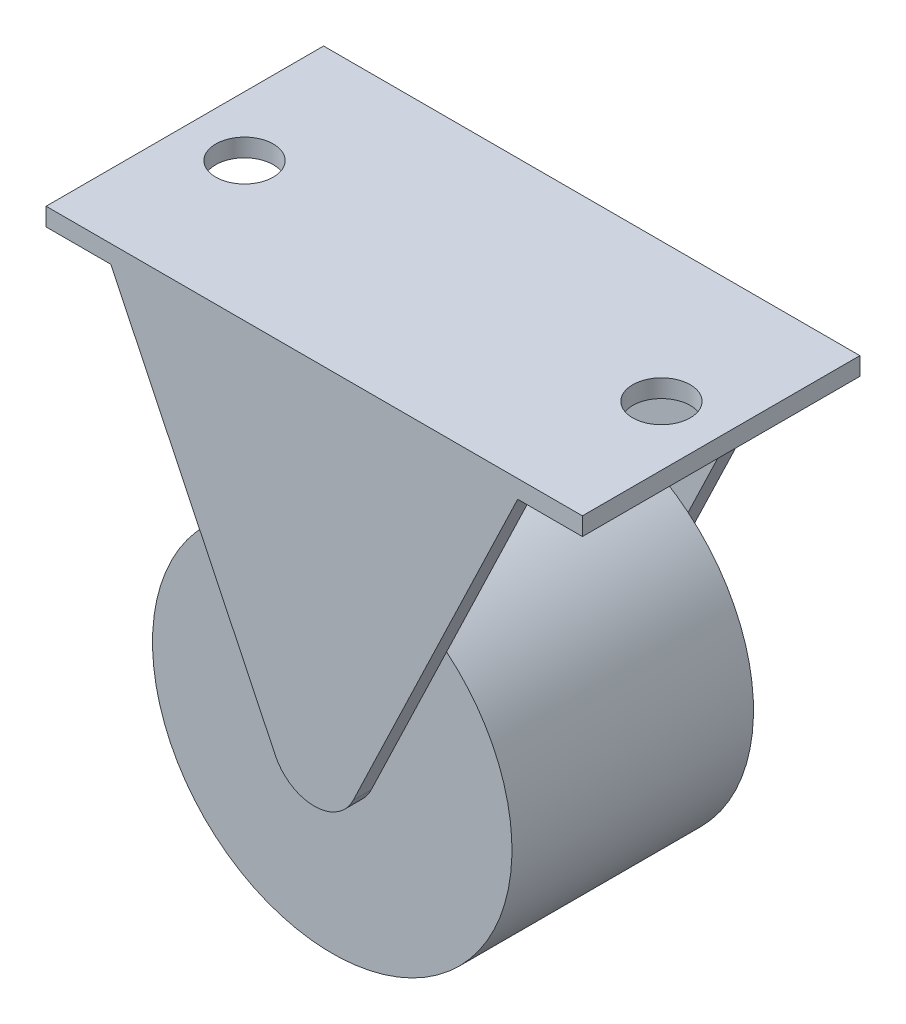
ISO-10303-21;
HEADER;
FILE_DESCRIPTION(('STEP AP214'),'2;1');
FILE_NAME('part.step','',(''),(''),'','','');
FILE_SCHEMA(('AUTOMOTIVE_DESIGN { 1 0 10303 214 1 1 1 1 }'));
ENDSEC;
DATA;
#1=APPLICATION_CONTEXT('core data for automotive mechanical design processes');
#2=APPLICATION_PROTOCOL_DEFINITION('international standard','automotive_design',2000,#1);
#3=PRODUCT_CONTEXT('',#1,'mechanical');
#4=PRODUCT('Part','Part','',(#3));
#5=PRODUCT_RELATED_PRODUCT_CATEGORY('part','',(#4));
#6=PRODUCT_DEFINITION_FORMATION('','',#4);
#7=PRODUCT_DEFINITION_CONTEXT('part definition',#1,'design');
#8=PRODUCT_DEFINITION('design','',#6,#7);
#9=PRODUCT_DEFINITION_SHAPE('','',#8);
#10=(LENGTH_UNIT() NAMED_UNIT(*) SI_UNIT(.MILLI.,.METRE.));
#11=(NAMED_UNIT(*) PLANE_ANGLE_UNIT() SI_UNIT($,.RADIAN.));
#12=(NAMED_UNIT(*) SI_UNIT($,.STERADIAN.) SOLID_ANGLE_UNIT());
#13=UNCERTAINTY_MEASURE_WITH_UNIT(LENGTH_MEASURE(1.E-05),#10,'distance_accuracy_value','');
#14=(GEOMETRIC_REPRESENTATION_CONTEXT(3) GLOBAL_UNCERTAINTY_ASSIGNED_CONTEXT((#13)) GLOBAL_UNIT_ASSIGNED_CONTEXT((#10,
#11,#12)) REPRESENTATION_CONTEXT('',''));
#15=CARTESIAN_POINT('',(0.,0.,0.));
#16=DIRECTION('',(0.,0.,1.));
#17=DIRECTION('',(1.,0.,0.));
#18=AXIS2_PLACEMENT_3D('',#15,#16,#17);
#19=CARTESIAN_POINT('',(0.,0.,0.));
#20=DIRECTION('',(0.,1.,0.));
#21=DIRECTION('',(0.,0.,1.));
#22=AXIS2_PLACEMENT_3D('',#19,#20,#21);
#23=PLANE('',#22);
#24=CARTESIAN_POINT('',(-14.5,0.,0.));
#25=DIRECTION('',(0.,1.,0.));
#26=DIRECTION('',(0.,0.,1.));
#27=AXIS2_PLACEMENT_3D('',#24,#25,#26);
#28=CIRCLE('',#27,2.);
#29=CARTESIAN_POINT('',(-14.5,0.,2.));
#30=VERTEX_POINT('',#29);
#31=EDGE_CURVE('E220',#30,#30,#28,.T.);
#32=ORIENTED_EDGE('',*,*,#31,.T.);
#33=EDGE_LOOP('',(#32));
#34=FACE_BOUND('',#33,.T.);
#35=CARTESIAN_POINT('',(14.5,0.,0.));
#36=DIRECTION('',(0.,1.,0.));
#37=DIRECTION('',(0.,0.,-1.));
#38=AXIS2_PLACEMENT_3D('',#35,#36,#37);
#39=CIRCLE('',#38,2.);
#40=CARTESIAN_POINT('',(14.5,0.,-2.));
#41=VERTEX_POINT('',#40);
#42=EDGE_CURVE('E211',#41,#41,#39,.T.);
#43=ORIENTED_EDGE('',*,*,#42,.T.);
#44=EDGE_LOOP('',(#43));
#45=FACE_BOUND('',#44,.T.);
#46=DIRECTION('',(0.,0.,-1.));
#47=VECTOR('',#46,1.);
#48=CARTESIAN_POINT('',(14.15,0.,-8.4));
#49=LINE('',#48,#47);
#50=CARTESIAN_POINT('',(14.15,0.,-8.4));
#51=VERTEX_POINT('',#50);
#52=CARTESIAN_POINT('',(14.15,0.,-9.65));
#53=VERTEX_POINT('',#52);
#54=EDGE_CURVE('E181',#51,#53,#49,.T.);
#55=ORIENTED_EDGE('',*,*,#54,.T.);
#56=DIRECTION('',(-1.,0.,0.));
#57=VECTOR('',#56,1.);
#58=CARTESIAN_POINT('',(-18.65,0.,-9.65));
#59=LINE('',#58,#57);
#60=CARTESIAN_POINT('',(18.65,0.,-9.65));
#61=VERTEX_POINT('',#60);
#62=EDGE_CURVE('E233',#61,#53,#59,.T.);
#63=ORIENTED_EDGE('',*,*,#62,.F.);
#64=DIRECTION('',(0.,0.,-1.));
#65=VECTOR('',#64,1.);
#66=CARTESIAN_POINT('',(18.65,0.,-9.65));
#67=LINE('',#66,#65);
#68=CARTESIAN_POINT('',(18.65,0.,9.65));
#69=VERTEX_POINT('',#68);
#70=EDGE_CURVE('E246',#69,#61,#67,.T.);
#71=ORIENTED_EDGE('',*,*,#70,.F.);
#72=DIRECTION('',(1.,0.,0.));
#73=VECTOR('',#72,1.);
#74=CARTESIAN_POINT('',(-18.65,0.,9.65));
#75=LINE('',#74,#73);
#76=CARTESIAN_POINT('',(14.15,0.,9.65));
#77=VERTEX_POINT('',#76);
#78=EDGE_CURVE('E242',#77,#69,#75,.T.);
#79=ORIENTED_EDGE('',*,*,#78,.F.);
#80=DIRECTION('',(0.,0.,1.));
#81=VECTOR('',#80,1.);
#82=CARTESIAN_POINT('',(14.15,0.,8.4));
#83=LINE('',#82,#81);
#84=CARTESIAN_POINT('',(14.15,0.,8.4));
#85=VERTEX_POINT('',#84);
#86=EDGE_CURVE('E212',#85,#77,#83,.T.);
#87=ORIENTED_EDGE('',*,*,#86,.F.);
#88=DIRECTION('',(-1.,0.,0.));
#89=VECTOR('',#88,1.);
#90=CARTESIAN_POINT('',(-14.15,0.,8.4));
#91=LINE('',#90,#89);
#92=CARTESIAN_POINT('',(-14.15,0.,8.4));
#93=VERTEX_POINT('',#92);
#94=EDGE_CURVE('E196',#85,#93,#91,.T.);
#95=ORIENTED_EDGE('',*,*,#94,.T.);
#96=DIRECTION('',(0.,0.,1.));
#97=VECTOR('',#96,1.);
#98=CARTESIAN_POINT('',(-14.15,0.,8.4));
#99=LINE('',#98,#97);
#100=CARTESIAN_POINT('',(-14.15,0.,9.65));
#101=VERTEX_POINT('',#100);
#102=EDGE_CURVE('E208',#93,#101,#99,.T.);
#103=ORIENTED_EDGE('',*,*,#102,.T.);
#104=CARTESIAN_POINT('',(-18.65,0.,9.65));
#105=VERTEX_POINT('',#104);
#106=EDGE_CURVE('E243',#105,#101,#75,.T.);
#107=ORIENTED_EDGE('',*,*,#106,.F.);
#108=DIRECTION('',(0.,0.,1.));
#109=VECTOR('',#108,1.);
#110=CARTESIAN_POINT('',(-18.65,0.,-9.65));
#111=LINE('',#110,#109);
#112=CARTESIAN_POINT('',(-18.65,0.,-9.65));
#113=VERTEX_POINT('',#112);
#114=EDGE_CURVE('E226',#113,#105,#111,.T.);
#115=ORIENTED_EDGE('',*,*,#114,.F.);
#116=CARTESIAN_POINT('',(-14.15,0.,-9.65));
#117=VERTEX_POINT('',#116);
#118=EDGE_CURVE('E248',#117,#113,#59,.T.);
#119=ORIENTED_EDGE('',*,*,#118,.F.);
#120=DIRECTION('',(0.,0.,-1.));
#121=VECTOR('',#120,1.);
#122=CARTESIAN_POINT('',(-14.15,0.,-8.4));
#123=LINE('',#122,#121);
#124=CARTESIAN_POINT('',(-14.15,0.,-8.4));
#125=VERTEX_POINT('',#124);
#126=EDGE_CURVE('E179',#125,#117,#123,.T.);
#127=ORIENTED_EDGE('',*,*,#126,.F.);
#128=DIRECTION('',(-1.,0.,0.));
#129=VECTOR('',#128,1.);
#130=CARTESIAN_POINT('',(-18.65,0.,-8.4));
#131=LINE('',#130,#129);
#132=EDGE_CURVE('E160',#51,#125,#131,.T.);
#133=ORIENTED_EDGE('',*,*,#132,.F.);
#134=EDGE_LOOP('',(#55,#63,#71,#79,#87,#95,#103,#107,#115,#119,#127,#133));
#135=FACE_BOUND('',#134,.T.);
#136=ADVANCED_FACE('F37',(#34,#45,#135),#23,.F.);
#137=CARTESIAN_POINT('',(0.,1.25,0.));
#138=DIRECTION('',(0.,1.,0.));
#139=DIRECTION('',(0.,0.,1.));
#140=AXIS2_PLACEMENT_3D('',#137,#138,#139);
#141=PLANE('',#140);
#142=CARTESIAN_POINT('',(-14.5,1.25,0.));
#143=DIRECTION('',(0.,1.,0.));
#144=DIRECTION('',(0.,0.,1.));
#145=AXIS2_PLACEMENT_3D('',#142,#143,#144);
#146=CIRCLE('',#145,2.);
#147=CARTESIAN_POINT('',(-14.5,1.25,2.));
#148=VERTEX_POINT('',#147);
#149=EDGE_CURVE('E223',#148,#148,#146,.T.);
#150=ORIENTED_EDGE('',*,*,#149,.F.);
#151=EDGE_LOOP('',(#150));
#152=FACE_BOUND('',#151,.T.);
#153=DIRECTION('',(0.,0.,1.));
#154=VECTOR('',#153,1.);
#155=CARTESIAN_POINT('',(-18.65,1.25,-9.65));
#156=LINE('',#155,#154);
#157=CARTESIAN_POINT('',(-18.65,1.25,-9.65));
#158=VERTEX_POINT('',#157);
#159=CARTESIAN_POINT('',(-18.65,1.25,9.65));
#160=VERTEX_POINT('',#159);
#161=EDGE_CURVE('E229',#158,#160,#156,.T.);
#162=ORIENTED_EDGE('',*,*,#161,.T.);
#163=DIRECTION('',(1.,0.,0.));
#164=VECTOR('',#163,1.);
#165=CARTESIAN_POINT('',(-18.65,1.25,9.65));
#166=LINE('',#165,#164);
#167=CARTESIAN_POINT('',(18.65,1.25,9.65));
#168=VERTEX_POINT('',#167);
#169=EDGE_CURVE('E232',#160,#168,#166,.T.);
#170=ORIENTED_EDGE('',*,*,#169,.T.);
#171=DIRECTION('',(0.,0.,-1.));
#172=VECTOR('',#171,1.);
#173=CARTESIAN_POINT('',(18.65,1.25,-9.65));
#174=LINE('',#173,#172);
#175=CARTESIAN_POINT('',(18.65,1.25,-9.65));
#176=VERTEX_POINT('',#175);
#177=EDGE_CURVE('E235',#168,#176,#174,.T.);
#178=ORIENTED_EDGE('',*,*,#177,.T.);
#179=DIRECTION('',(-1.,0.,0.));
#180=VECTOR('',#179,1.);
#181=CARTESIAN_POINT('',(-18.65,1.25,-9.65));
#182=LINE('',#181,#180);
#183=EDGE_CURVE('E237',#176,#158,#182,.T.);
#184=ORIENTED_EDGE('',*,*,#183,.T.);
#185=EDGE_LOOP('',(#162,#170,#178,#184));
#186=FACE_BOUND('',#185,.T.);
#187=CARTESIAN_POINT('',(14.5,1.25,0.));
#188=DIRECTION('',(0.,1.,0.));
#189=DIRECTION('',(0.,0.,-1.));
#190=AXIS2_PLACEMENT_3D('',#187,#188,#189);
#191=CIRCLE('',#190,2.);
#192=CARTESIAN_POINT('',(14.5,1.25,-2.));
#193=VERTEX_POINT('',#192);
#194=EDGE_CURVE('E217',#193,#193,#191,.T.);
#195=ORIENTED_EDGE('',*,*,#194,.F.);
#196=EDGE_LOOP('',(#195));
#197=FACE_BOUND('',#196,.T.);
#198=ADVANCED_FACE('F276',(#152,#186,#197),#141,.T.);
#199=CARTESIAN_POINT('',(-18.65,1.25,-9.65));
#200=DIRECTION('',(1.,0.,0.));
#201=DIRECTION('',(0.,0.,-1.));
#202=AXIS2_PLACEMENT_3D('',#199,#200,#201);
#203=PLANE('',#202);
#204=ORIENTED_EDGE('',*,*,#114,.T.);
#205=DIRECTION('',(0.,-1.,0.));
#206=VECTOR('',#205,1.);
#207=CARTESIAN_POINT('',(-18.65,1.25,9.65));
#208=LINE('',#207,#206);
#209=EDGE_CURVE('E11',#160,#105,#208,.T.);
#210=ORIENTED_EDGE('',*,*,#209,.F.);
#211=ORIENTED_EDGE('',*,*,#161,.F.);
#212=DIRECTION('',(0.,-1.,0.));
#213=VECTOR('',#212,1.);
#214=CARTESIAN_POINT('',(-18.65,1.25,-9.65));
#215=LINE('',#214,#213);
#216=EDGE_CURVE('E239',#158,#113,#215,.T.);
#217=ORIENTED_EDGE('',*,*,#216,.T.);
#218=EDGE_LOOP('',(#204,#210,#211,#217));
#219=FACE_BOUND('',#218,.T.);
#220=ADVANCED_FACE('F39',(#219),#203,.F.);
#221=CARTESIAN_POINT('',(-18.65,1.25,9.65));
#222=DIRECTION('',(0.,0.,-1.));
#223=DIRECTION('',(-1.,0.,0.));
#224=AXIS2_PLACEMENT_3D('',#221,#222,#223);
#225=PLANE('',#224);
#226=ORIENTED_EDGE('',*,*,#106,.T.);
#227=DIRECTION('',(0.432482642961931,-0.901642259178585,0.));
#228=VECTOR('',#227,1.);
#229=CARTESIAN_POINT('',(-2.70492677753578,-23.8607533613212,9.65));
#230=LINE('',#229,#228);
#231=CARTESIAN_POINT('',(-2.70492677753578,-23.8607533613212,9.65));
#232=VERTEX_POINT('',#231);
#233=EDGE_CURVE('E184',#101,#232,#230,.T.);
#234=ORIENTED_EDGE('',*,*,#233,.T.);
#235=CARTESIAN_POINT('',(0.,-22.5633054324354,9.65));
#236=DIRECTION('',(0.,0.,1.));
#237=DIRECTION('',(-1.,0.,0.));
#238=AXIS2_PLACEMENT_3D('',#235,#236,#237);
#239=CIRCLE('',#238,3.);
#240=CARTESIAN_POINT('',(2.70492677753578,-23.8607533613212,9.65));
#241=VERTEX_POINT('',#240);
#242=EDGE_CURVE('E202',#232,#241,#239,.T.);
#243=ORIENTED_EDGE('',*,*,#242,.T.);
#244=DIRECTION('',(0.432482642961931,0.901642259178585,0.));
#245=VECTOR('',#244,1.);
#246=CARTESIAN_POINT('',(14.15,0.,9.65));
#247=LINE('',#246,#245);
#248=EDGE_CURVE('E205',#241,#77,#247,.T.);
#249=ORIENTED_EDGE('',*,*,#248,.T.);
#250=ORIENTED_EDGE('',*,*,#78,.T.);
#251=DIRECTION('',(0.,-1.,0.));
#252=VECTOR('',#251,1.);
#253=CARTESIAN_POINT('',(18.65,1.25,9.65));
#254=LINE('',#253,#252);
#255=EDGE_CURVE('E45',#168,#69,#254,.T.);
#256=ORIENTED_EDGE('',*,*,#255,.F.);
#257=ORIENTED_EDGE('',*,*,#169,.F.);
#258=ORIENTED_EDGE('',*,*,#209,.T.);
#259=EDGE_LOOP('',(#226,#234,#243,#249,#250,#256,#257,#258));
#260=FACE_BOUND('',#259,.T.);
#261=ADVANCED_FACE('F279',(#260),#225,.F.);
#262=CARTESIAN_POINT('',(18.65,1.25,-9.65));
#263=DIRECTION('',(-1.,0.,0.));
#264=DIRECTION('',(0.,0.,1.));
#265=AXIS2_PLACEMENT_3D('',#262,#263,#264);
#266=PLANE('',#265);
#267=ORIENTED_EDGE('',*,*,#70,.T.);
#268=DIRECTION('',(0.,-1.,0.));
#269=VECTOR('',#268,1.);
#270=CARTESIAN_POINT('',(18.65,1.25,-9.65));
#271=LINE('',#270,#269);
#272=EDGE_CURVE('E253',#176,#61,#271,.T.);
#273=ORIENTED_EDGE('',*,*,#272,.F.);
#274=ORIENTED_EDGE('',*,*,#177,.F.);
#275=ORIENTED_EDGE('',*,*,#255,.T.);
#276=EDGE_LOOP('',(#267,#273,#274,#275));
#277=FACE_BOUND('',#276,.T.);
#278=ADVANCED_FACE('F260',(#277),#266,.F.);
#279=CARTESIAN_POINT('',(-18.65,1.25,-9.65));
#280=DIRECTION('',(0.,0.,1.));
#281=DIRECTION('',(1.,0.,0.));
#282=AXIS2_PLACEMENT_3D('',#279,#280,#281);
#283=PLANE('',#282);
#284=ORIENTED_EDGE('',*,*,#62,.T.);
#285=DIRECTION('',(0.432482642961932,0.901642259178585,0.));
#286=VECTOR('',#285,1.);
#287=CARTESIAN_POINT('',(8.50247822807218,-11.7739853195668,-9.65));
#288=LINE('',#287,#286);
#289=CARTESIAN_POINT('',(2.70492677753578,-23.8607533613212,-9.65));
#290=VERTEX_POINT('',#289);
#291=EDGE_CURVE('E150',#290,#53,#288,.T.);
#292=ORIENTED_EDGE('',*,*,#291,.F.);
#293=CARTESIAN_POINT('',(0.,-22.5633054324354,-9.65));
#294=DIRECTION('',(0.,0.,1.));
#295=DIRECTION('',(1.,0.,0.));
#296=AXIS2_PLACEMENT_3D('',#293,#294,#295);
#297=CIRCLE('',#296,3.);
#298=CARTESIAN_POINT('',(-2.70492677753577,-23.8607533613212,-9.65));
#299=VERTEX_POINT('',#298);
#300=EDGE_CURVE('E173',#299,#290,#297,.T.);
#301=ORIENTED_EDGE('',*,*,#300,.F.);
#302=DIRECTION('',(0.432482642961932,-0.901642259178585,0.));
#303=VECTOR('',#302,1.);
#304=CARTESIAN_POINT('',(-15.4791163481547,2.77094927707157,-9.65));
#305=LINE('',#304,#303);
#306=EDGE_CURVE('E171',#117,#299,#305,.T.);
#307=ORIENTED_EDGE('',*,*,#306,.F.);
#308=ORIENTED_EDGE('',*,*,#118,.T.);
#309=ORIENTED_EDGE('',*,*,#216,.F.);
#310=ORIENTED_EDGE('',*,*,#183,.F.);
#311=ORIENTED_EDGE('',*,*,#272,.T.);
#312=EDGE_LOOP('',(#284,#292,#301,#307,#308,#309,#310,#311));
#313=FACE_BOUND('',#312,.T.);
#314=ADVANCED_FACE('F270',(#313),#283,.F.);
#315=CARTESIAN_POINT('',(-14.5,1.25,0.));
#316=DIRECTION('',(0.,-1.,0.));
#317=DIRECTION('',(0.,0.,-1.));
#318=AXIS2_PLACEMENT_3D('',#315,#316,#317);
#319=CYLINDRICAL_SURFACE('',#318,2.);
#320=ORIENTED_EDGE('',*,*,#149,.T.);
#321=EDGE_LOOP('',(#320));
#322=FACE_BOUND('',#321,.T.);
#323=ORIENTED_EDGE('',*,*,#31,.F.);
#324=EDGE_LOOP('',(#323));
#325=FACE_BOUND('',#324,.T.);
#326=ADVANCED_FACE('F320',(#322,#325),#319,.F.);
#327=CARTESIAN_POINT('',(14.5,1.25,0.));
#328=DIRECTION('',(0.,-1.,0.));
#329=DIRECTION('',(0.,0.,-1.));
#330=AXIS2_PLACEMENT_3D('',#327,#328,#329);
#331=CYLINDRICAL_SURFACE('',#330,2.);
#332=ORIENTED_EDGE('',*,*,#194,.T.);
#333=EDGE_LOOP('',(#332));
#334=FACE_BOUND('',#333,.T.);
#335=ORIENTED_EDGE('',*,*,#42,.F.);
#336=EDGE_LOOP('',(#335));
#337=FACE_BOUND('',#336,.T.);
#338=ADVANCED_FACE('F365',(#334,#337),#331,.F.);
#339=CARTESIAN_POINT('',(-2.70492677753578,-23.8607533613212,8.4));
#340=DIRECTION('',(-0.901642259178585,-0.432482642961931,0.));
#341=DIRECTION('',(0.432482642961932,-0.901642259178585,0.));
#342=AXIS2_PLACEMENT_3D('',#339,#340,#341);
#343=PLANE('',#342);
#344=ORIENTED_EDGE('',*,*,#233,.F.);
#345=ORIENTED_EDGE('',*,*,#102,.F.);
#346=DIRECTION('',(0.432482642961931,-0.901642259178585,0.));
#347=VECTOR('',#346,1.);
#348=CARTESIAN_POINT('',(-2.70492677753578,-23.8607533613212,8.4));
#349=LINE('',#348,#347);
#350=CARTESIAN_POINT('',(-7.95295708129987,-12.9196301131911,8.4));
#351=VERTEX_POINT('',#350);
#352=EDGE_CURVE('E185',#93,#351,#349,.T.);
#353=ORIENTED_EDGE('',*,*,#352,.T.);
#354=CARTESIAN_POINT('',(-2.70492677753578,-23.8607533613212,8.4));
#355=VERTEX_POINT('',#354);
#356=EDGE_CURVE('E189',#351,#355,#349,.T.);
#357=ORIENTED_EDGE('',*,*,#356,.T.);
#358=DIRECTION('',(0.,0.,1.));
#359=VECTOR('',#358,1.);
#360=CARTESIAN_POINT('',(-2.70492677753578,-23.8607533613212,8.4));
#361=LINE('',#360,#359);
#362=EDGE_CURVE('E199',#355,#232,#361,.T.);
#363=ORIENTED_EDGE('',*,*,#362,.T.);
#364=EDGE_LOOP('',(#344,#345,#353,#357,#363));
#365=FACE_BOUND('',#364,.T.);
#366=ADVANCED_FACE('F286',(#365),#343,.T.);
#367=CARTESIAN_POINT('',(14.15,0.,8.4));
#368=DIRECTION('',(0.901642259178585,-0.432482642961931,0.));
#369=DIRECTION('',(0.432482642961931,0.901642259178585,0.));
#370=AXIS2_PLACEMENT_3D('',#367,#368,#369);
#371=PLANE('',#370);
#372=ORIENTED_EDGE('',*,*,#248,.F.);
#373=DIRECTION('',(0.,0.,1.));
#374=VECTOR('',#373,1.);
#375=CARTESIAN_POINT('',(2.70492677753578,-23.8607533613212,8.4));
#376=LINE('',#375,#374);
#377=CARTESIAN_POINT('',(2.70492677753578,-23.8607533613212,8.4));
#378=VERTEX_POINT('',#377);
#379=EDGE_CURVE('E214',#378,#241,#376,.T.);
#380=ORIENTED_EDGE('',*,*,#379,.F.);
#381=DIRECTION('',(0.432482642961931,0.901642259178585,0.));
#382=VECTOR('',#381,1.);
#383=CARTESIAN_POINT('',(14.15,0.,8.4));
#384=LINE('',#383,#382);
#385=CARTESIAN_POINT('',(7.95295708129987,-12.9196301131911,8.4));
#386=VERTEX_POINT('',#385);
#387=EDGE_CURVE('E193',#378,#386,#384,.T.);
#388=ORIENTED_EDGE('',*,*,#387,.T.);
#389=EDGE_CURVE('E192',#386,#85,#384,.T.);
#390=ORIENTED_EDGE('',*,*,#389,.T.);
#391=ORIENTED_EDGE('',*,*,#86,.T.);
#392=EDGE_LOOP('',(#372,#380,#388,#390,#391));
#393=FACE_BOUND('',#392,.T.);
#394=ADVANCED_FACE('F387',(#393),#371,.T.);
#395=CARTESIAN_POINT('',(0.,-22.5633054324354,8.4));
#396=DIRECTION('',(0.,0.,1.));
#397=DIRECTION('',(1.,0.,0.));
#398=AXIS2_PLACEMENT_3D('',#395,#396,#397);
#399=CYLINDRICAL_SURFACE('',#398,3.);
#400=ORIENTED_EDGE('',*,*,#242,.F.);
#401=ORIENTED_EDGE('',*,*,#362,.F.);
#402=CARTESIAN_POINT('',(0.,-22.5633054324354,8.4));
#403=DIRECTION('',(0.,0.,1.));
#404=DIRECTION('',(-1.,0.,0.));
#405=AXIS2_PLACEMENT_3D('',#402,#403,#404);
#406=CIRCLE('',#405,3.);
#407=EDGE_CURVE('E188',#355,#378,#406,.T.);
#408=ORIENTED_EDGE('',*,*,#407,.T.);
#409=ORIENTED_EDGE('',*,*,#379,.T.);
#410=EDGE_LOOP('',(#400,#401,#408,#409));
#411=FACE_BOUND('',#410,.T.);
#412=ADVANCED_FACE('F396',(#411),#399,.T.);
#413=CARTESIAN_POINT('',(0.,-22.5633054324354,8.4));
#414=DIRECTION('',(0.,0.,-1.));
#415=DIRECTION('',(-1.,0.,0.));
#416=AXIS2_PLACEMENT_3D('',#413,#414,#415);
#417=PLANE('',#416);
#418=ORIENTED_EDGE('',*,*,#389,.F.);
#419=CARTESIAN_POINT('',(0.,-22.5633054324354,8.4));
#420=DIRECTION('',(0.,0.,-1.));
#421=DIRECTION('',(-1.,0.,0.));
#422=AXIS2_PLACEMENT_3D('',#419,#420,#421);
#423=CIRCLE('',#422,12.5);
#424=EDGE_CURVE('E144',#351,#386,#423,.T.);
#425=ORIENTED_EDGE('',*,*,#424,.F.);
#426=ORIENTED_EDGE('',*,*,#352,.F.);
#427=ORIENTED_EDGE('',*,*,#94,.F.);
#428=EDGE_LOOP('',(#418,#425,#426,#427));
#429=FACE_BOUND('',#428,.T.);
#430=ADVANCED_FACE('F291',(#429),#417,.T.);
#431=CARTESIAN_POINT('',(8.50247822807218,-11.7739853195668,-8.4));
#432=DIRECTION('',(-0.901642259178585,0.432482642961931,0.));
#433=DIRECTION('',(-0.432482642961931,-0.901642259178585,0.));
#434=AXIS2_PLACEMENT_3D('',#431,#432,#433);
#435=PLANE('',#434);
#436=ORIENTED_EDGE('',*,*,#291,.T.);
#437=ORIENTED_EDGE('',*,*,#54,.F.);
#438=DIRECTION('',(0.432482642961932,0.901642259178585,0.));
#439=VECTOR('',#438,1.);
#440=CARTESIAN_POINT('',(8.50247822807218,-11.7739853195668,-8.4));
#441=LINE('',#440,#439);
#442=CARTESIAN_POINT('',(7.95295708129987,-12.9196301131911,-8.4));
#443=VERTEX_POINT('',#442);
#444=EDGE_CURVE('E175',#443,#51,#441,.T.);
#445=ORIENTED_EDGE('',*,*,#444,.F.);
#446=CARTESIAN_POINT('',(2.70492677753578,-23.8607533613212,-8.4));
#447=VERTEX_POINT('',#446);
#448=EDGE_CURVE('E141',#447,#443,#441,.T.);
#449=ORIENTED_EDGE('',*,*,#448,.F.);
#450=DIRECTION('',(0.,0.,-1.));
#451=VECTOR('',#450,1.);
#452=CARTESIAN_POINT('',(2.70492677753578,-23.8607533613212,-8.4));
#453=LINE('',#452,#451);
#454=EDGE_CURVE('E165',#447,#290,#453,.T.);
#455=ORIENTED_EDGE('',*,*,#454,.T.);
#456=EDGE_LOOP('',(#436,#437,#445,#449,#455));
#457=FACE_BOUND('',#456,.T.);
#458=ADVANCED_FACE('F294',(#457),#435,.F.);
#459=CARTESIAN_POINT('',(-15.4791163481547,2.77094927707157,-8.4));
#460=DIRECTION('',(0.901642259178585,0.432482642961931,0.));
#461=DIRECTION('',(-0.432482642961931,0.901642259178585,0.));
#462=AXIS2_PLACEMENT_3D('',#459,#460,#461);
#463=PLANE('',#462);
#464=ORIENTED_EDGE('',*,*,#306,.T.);
#465=DIRECTION('',(0.,0.,-1.));
#466=VECTOR('',#465,1.);
#467=CARTESIAN_POINT('',(-2.70492677753577,-23.8607533613212,-8.4));
#468=LINE('',#467,#466);
#469=CARTESIAN_POINT('',(-2.70492677753577,-23.8607533613212,-8.4));
#470=VERTEX_POINT('',#469);
#471=EDGE_CURVE('E158',#470,#299,#468,.T.);
#472=ORIENTED_EDGE('',*,*,#471,.F.);
#473=DIRECTION('',(0.432482642961932,-0.901642259178585,0.));
#474=VECTOR('',#473,1.);
#475=CARTESIAN_POINT('',(-15.4791163481547,2.77094927707157,-8.4));
#476=LINE('',#475,#474);
#477=CARTESIAN_POINT('',(-7.95295708129987,-12.9196301131911,-8.4));
#478=VERTEX_POINT('',#477);
#479=EDGE_CURVE('E138',#478,#470,#476,.T.);
#480=ORIENTED_EDGE('',*,*,#479,.F.);
#481=EDGE_CURVE('E155',#125,#478,#476,.T.);
#482=ORIENTED_EDGE('',*,*,#481,.F.);
#483=ORIENTED_EDGE('',*,*,#126,.T.);
#484=EDGE_LOOP('',(#464,#472,#480,#482,#483));
#485=FACE_BOUND('',#484,.T.);
#486=ADVANCED_FACE('F153',(#485),#463,.F.);
#487=CARTESIAN_POINT('',(0.,-22.5633054324354,-8.4));
#488=DIRECTION('',(0.,0.,-1.));
#489=DIRECTION('',(-1.,0.,0.));
#490=AXIS2_PLACEMENT_3D('',#487,#488,#489);
#491=CYLINDRICAL_SURFACE('',#490,3.);
#492=ORIENTED_EDGE('',*,*,#300,.T.);
#493=ORIENTED_EDGE('',*,*,#454,.F.);
#494=CARTESIAN_POINT('',(0.,-22.5633054324354,-8.4));
#495=DIRECTION('',(0.,0.,1.));
#496=DIRECTION('',(1.,0.,0.));
#497=AXIS2_PLACEMENT_3D('',#494,#495,#496);
#498=CIRCLE('',#497,3.);
#499=EDGE_CURVE('E164',#470,#447,#498,.T.);
#500=ORIENTED_EDGE('',*,*,#499,.F.);
#501=ORIENTED_EDGE('',*,*,#471,.T.);
#502=EDGE_LOOP('',(#492,#493,#500,#501));
#503=FACE_BOUND('',#502,.T.);
#504=ADVANCED_FACE('F296',(#503),#491,.T.);
#505=CARTESIAN_POINT('',(0.,-22.5633054324354,-8.4));
#506=DIRECTION('',(0.,0.,1.));
#507=DIRECTION('',(1.,0.,0.));
#508=AXIS2_PLACEMENT_3D('',#505,#506,#507);
#509=PLANE('',#508);
#510=ORIENTED_EDGE('',*,*,#481,.T.);
#511=CARTESIAN_POINT('',(0.,-22.5633054324354,-8.4));
#512=DIRECTION('',(0.,0.,1.));
#513=DIRECTION('',(1.,0.,0.));
#514=AXIS2_PLACEMENT_3D('',#511,#512,#513);
#515=CIRCLE('',#514,12.5);
#516=EDGE_CURVE('E143',#443,#478,#515,.T.);
#517=ORIENTED_EDGE('',*,*,#516,.F.);
#518=ORIENTED_EDGE('',*,*,#444,.T.);
#519=ORIENTED_EDGE('',*,*,#132,.T.);
#520=EDGE_LOOP('',(#510,#517,#518,#519));
#521=FACE_BOUND('',#520,.T.);
#522=ADVANCED_FACE('F162',(#521),#509,.T.);
#523=CARTESIAN_POINT('',(0.,-22.5633054324354,8.4));
#524=DIRECTION('',(0.,0.,-1.));
#525=DIRECTION('',(-1.,0.,0.));
#526=AXIS2_PLACEMENT_3D('',#523,#524,#525);
#527=PLANE('',#526);
#528=ORIENTED_EDGE('',*,*,#356,.F.);
#529=EDGE_CURVE('E51',#386,#351,#423,.T.);
#530=ORIENTED_EDGE('',*,*,#529,.F.);
#531=ORIENTED_EDGE('',*,*,#387,.F.);
#532=ORIENTED_EDGE('',*,*,#407,.F.);
#533=EDGE_LOOP('',(#528,#530,#531,#532));
#534=FACE_BOUND('',#533,.T.);
#535=ADVANCED_FACE('F304',(#534),#527,.F.);
#536=CARTESIAN_POINT('',(0.,-22.5633054324354,-43.7553390593274));
#537=DIRECTION('',(0.,0.,1.));
#538=DIRECTION('',(1.,0.,0.));
#539=AXIS2_PLACEMENT_3D('',#536,#537,#538);
#540=CYLINDRICAL_SURFACE('',#539,12.5);
#541=ORIENTED_EDGE('',*,*,#516,.T.);
#542=EDGE_CURVE('E58',#478,#443,#515,.T.);
#543=ORIENTED_EDGE('',*,*,#542,.T.);
#544=EDGE_LOOP('',(#541,#543));
#545=FACE_BOUND('',#544,.T.);
#546=ORIENTED_EDGE('',*,*,#424,.T.);
#547=ORIENTED_EDGE('',*,*,#529,.T.);
#548=EDGE_LOOP('',(#546,#547));
#549=FACE_BOUND('',#548,.T.);
#550=ADVANCED_FACE('F146',(#545,#549),#540,.T.);
#551=CARTESIAN_POINT('',(0.,-22.5633054324354,-8.4));
#552=DIRECTION('',(0.,0.,1.));
#553=DIRECTION('',(1.,0.,0.));
#554=AXIS2_PLACEMENT_3D('',#551,#552,#553);
#555=PLANE('',#554);
#556=ORIENTED_EDGE('',*,*,#499,.T.);
#557=ORIENTED_EDGE('',*,*,#448,.T.);
#558=ORIENTED_EDGE('',*,*,#542,.F.);
#559=ORIENTED_EDGE('',*,*,#479,.T.);
#560=EDGE_LOOP('',(#556,#557,#558,#559));
#561=FACE_BOUND('',#560,.T.);
#562=ADVANCED_FACE('F136',(#561),#555,.F.);
#563=CLOSED_SHELL('',(#136,#198,#220,#261,#278,#314,#326,#338,#366,#394,#412,#430,#458,#486,
#504,#522,#535,#550,#562));
#564=MANIFOLD_SOLID_BREP('B2',#563);
#565=ADVANCED_BREP_SHAPE_REPRESENTATION('',(#18,#564),#14);
#566=SHAPE_DEFINITION_REPRESENTATION(#9,#565);
ENDSEC;
END-ISO-10303-21;
